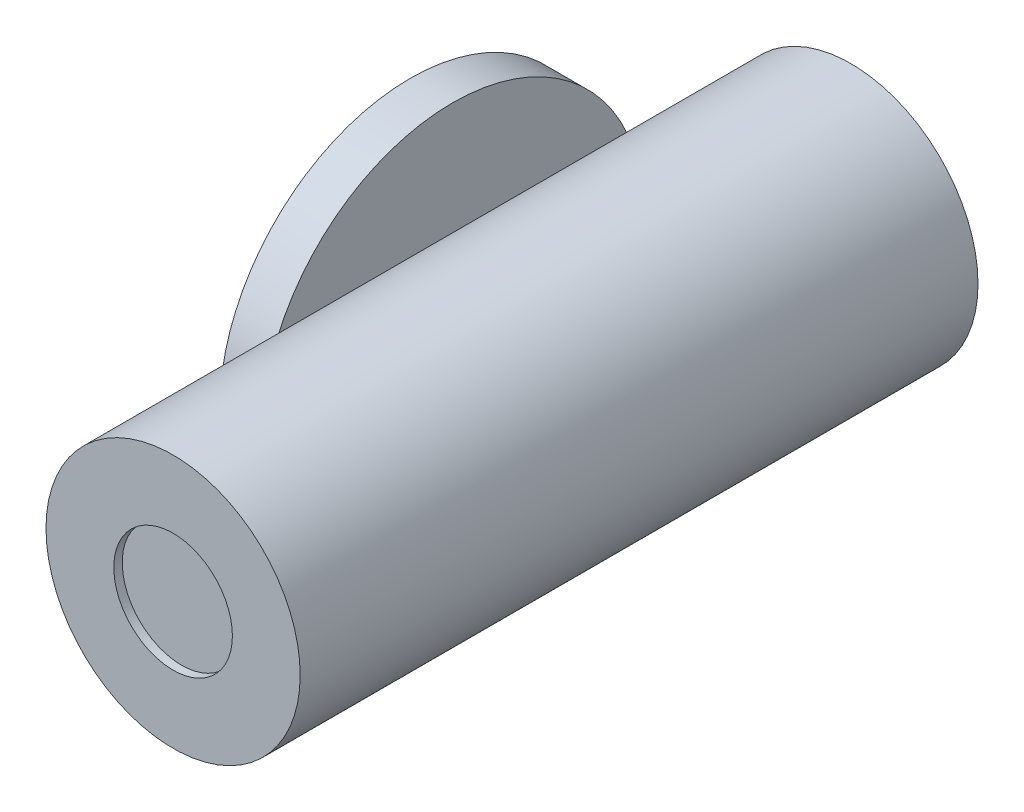
ISO-10303-21;
HEADER;
FILE_DESCRIPTION(('STEP AP214'),'2;1');
FILE_NAME('part.step','',(''),(''),'','','');
FILE_SCHEMA(('AUTOMOTIVE_DESIGN { 1 0 10303 214 1 1 1 1 }'));
ENDSEC;
DATA;
#1=APPLICATION_CONTEXT('core data for automotive mechanical design processes');
#2=APPLICATION_PROTOCOL_DEFINITION('international standard','automotive_design',2000,#1);
#3=PRODUCT_CONTEXT('',#1,'mechanical');
#4=PRODUCT('Part','Part','',(#3));
#5=PRODUCT_RELATED_PRODUCT_CATEGORY('part','',(#4));
#6=PRODUCT_DEFINITION_FORMATION('','',#4);
#7=PRODUCT_DEFINITION_CONTEXT('part definition',#1,'design');
#8=PRODUCT_DEFINITION('design','',#6,#7);
#9=PRODUCT_DEFINITION_SHAPE('','',#8);
#10=(LENGTH_UNIT() NAMED_UNIT(*) SI_UNIT(.MILLI.,.METRE.));
#11=(NAMED_UNIT(*) PLANE_ANGLE_UNIT() SI_UNIT($,.RADIAN.));
#12=(NAMED_UNIT(*) SI_UNIT($,.STERADIAN.) SOLID_ANGLE_UNIT());
#13=UNCERTAINTY_MEASURE_WITH_UNIT(LENGTH_MEASURE(1.E-05),#10,'distance_accuracy_value','');
#14=(GEOMETRIC_REPRESENTATION_CONTEXT(3) GLOBAL_UNCERTAINTY_ASSIGNED_CONTEXT((#13)) GLOBAL_UNIT_ASSIGNED_CONTEXT((#10,
#11,#12)) REPRESENTATION_CONTEXT('',''));
#15=CARTESIAN_POINT('',(0.,0.,0.));
#16=DIRECTION('',(0.,0.,1.));
#17=DIRECTION('',(1.,0.,0.));
#18=AXIS2_PLACEMENT_3D('',#15,#16,#17);
#19=CARTESIAN_POINT('',(0.,0.,-800.));
#20=DIRECTION('',(0.,0.,1.));
#21=DIRECTION('',(1.,0.,0.));
#22=AXIS2_PLACEMENT_3D('',#19,#20,#21);
#23=CYLINDRICAL_SURFACE('',#22,150.);
#24=DIRECTION('',(0.,0.,1.));
#25=VECTOR('',#24,1.);
#26=CARTESIAN_POINT('',(-120.,90.,-800.));
#27=LINE('',#26,#25);
#28=CARTESIAN_POINT('',(-120.,90.,-243.784093726987));
#29=VERTEX_POINT('',#28);
#30=CARTESIAN_POINT('',(-120.,90.,-656.215906273013));
#31=VERTEX_POINT('',#30);
#32=EDGE_CURVE('E43',#29,#31,#27,.F.);
#33=ORIENTED_EDGE('',*,*,#32,.F.);
#34=CARTESIAN_POINT('',(-120.,-90.,-243.784093726987));
#35=CARTESIAN_POINT('',(-121.126389329248,-88.4981454170554,-243.128612547082));
#36=CARTESIAN_POINT('',(-122.226549297826,-86.972528100177,-242.482328256559));
#37=CARTESIAN_POINT('',(-124.372689997783,-83.8748165642376,-241.211072203129));
#38=CARTESIAN_POINT('',(-125.418666353184,-82.3027186073626,-240.586102162991));
#39=CARTESIAN_POINT('',(-127.455283463712,-79.1121676508049,-239.360050697722));
#40=CARTESIAN_POINT('',(-128.445883082134,-77.4936815069204,-238.75898712472));
#41=CARTESIAN_POINT('',(-130.368951037826,-74.2128827527093,-237.584172542745));
#42=CARTESIAN_POINT('',(-131.301420604153,-72.5505710700543,-237.01042095637));
#43=CARTESIAN_POINT('',(-133.11098739874,-69.174792202597,-235.890150933076));
#44=CARTESIAN_POINT('',(-133.987766725815,-67.4611014967038,-235.343792047389));
#45=CARTESIAN_POINT('',(-135.678421905841,-63.9928703294791,-234.284446226629));
#46=CARTESIAN_POINT('',(-136.492298701666,-62.2383304809665,-233.771458791355));
#47=CARTESIAN_POINT('',(-138.054849986402,-58.6908353462642,-232.781731493138));
#48=CARTESIAN_POINT('',(-138.803537329067,-56.8978877204107,-232.304984486841));
#49=CARTESIAN_POINT('',(-140.233726013293,-53.2756375313788,-231.390311970333));
#50=CARTESIAN_POINT('',(-140.915227443234,-51.4463350160268,-230.952386409054));
#51=CARTESIAN_POINT('',(-142.21216020813,-47.7448060050651,-230.115822042446));
#52=CARTESIAN_POINT('',(-142.827243164258,-45.8724102876585,-229.717391212647));
#53=CARTESIAN_POINT('',(-143.985313451559,-42.0966602286225,-228.964761162196));
#54=CARTESIAN_POINT('',(-144.528300672953,-40.1933058398575,-228.610562008894));
#55=CARTESIAN_POINT('',(-145.540256761149,-36.358846240455,-227.948609906984));
#56=CARTESIAN_POINT('',(-146.009219524083,-34.4277387556767,-227.64086078862));
#57=CARTESIAN_POINT('',(-146.871276096703,-30.5416023593706,-227.073854573456));
#58=CARTESIAN_POINT('',(-147.264370135752,-28.5865735201794,-226.814597330057));
#59=CARTESIAN_POINT('',(-147.972099681991,-24.6621534340785,-226.346983205006));
#60=CARTESIAN_POINT('',(-148.286955845886,-22.6928190810244,-226.138483205701));
#61=CARTESIAN_POINT('',(-148.838353824848,-18.7384535650031,-225.772854086873));
#62=CARTESIAN_POINT('',(-149.074895253574,-16.7534223246497,-225.615725220773));
#63=CARTESIAN_POINT('',(-149.468626798959,-12.7722519355488,-225.353947786108));
#64=CARTESIAN_POINT('',(-149.62582465613,-10.7761138895635,-225.249294098234));
#65=CARTESIAN_POINT('',(-149.86020993863,-6.7770933021634,-225.093186319033));
#66=CARTESIAN_POINT('',(-149.937399158507,-4.77421091303138,-225.041731034495));
#67=CARTESIAN_POINT('',(-150.007998977627,-0.952275971438666,-224.994668401487));
#68=CARTESIAN_POINT('',(-150.008517727892,0.866592257668275,-224.994322664974));
#69=CARTESIAN_POINT('',(-149.94343147332,4.5025948688147,-225.037709775548));
#70=CARTESIAN_POINT('',(-149.877827792812,6.31972928485015,-225.081441739828));
#71=CARTESIAN_POINT('',(-149.680742782046,9.9487308497767,-225.212724180992));
#72=CARTESIAN_POINT('',(-149.549264943015,11.7605982726921,-225.300272335688));
#73=CARTESIAN_POINT('',(-149.220909191484,15.3757804032027,-225.518676247004));
#74=CARTESIAN_POINT('',(-149.024030931368,17.1790950652865,-225.649532233814));
#75=CARTESIAN_POINT('',(-148.565372400745,20.7754438863894,-225.953932347421));
#76=CARTESIAN_POINT('',(-148.303535152524,22.568467598659,-226.127513949238));
#77=CARTESIAN_POINT('',(-147.715954711025,26.1394539431661,-226.516321033362));
#78=CARTESIAN_POINT('',(-147.39021151744,27.9174165753312,-226.73154651587));
#79=CARTESIAN_POINT('',(-146.675917003816,31.455237538646,-227.202440495581));
#80=CARTESIAN_POINT('',(-146.287366545213,33.2150961177511,-227.458108438092));
#81=CARTESIAN_POINT('',(-145.448706345809,36.7138948239461,-228.008499986117));
#82=CARTESIAN_POINT('',(-144.998596789112,38.4528350135798,-228.303223474827));
#83=CARTESIAN_POINT('',(-144.047604979745,41.8733404942227,-228.92402814817));
#84=CARTESIAN_POINT('',(-143.547889267661,43.5553625406515,-229.249382453279));
#85=CARTESIAN_POINT('',(-142.491967609481,46.8946251748363,-229.934556448336));
#86=CARTESIAN_POINT('',(-141.93575670071,48.5518635708417,-230.294379165914));
#87=CARTESIAN_POINT('',(-140.768368376429,51.839259863326,-231.046730196239));
#88=CARTESIAN_POINT('',(-140.157192609807,53.4694185704302,-231.439257527855));
#89=CARTESIAN_POINT('',(-138.881323727456,56.700933159619,-232.255237579415));
#90=CARTESIAN_POINT('',(-138.216626450736,58.3022867904117,-232.678692703578));
#91=CARTESIAN_POINT('',(-136.835775575949,61.4732371732078,-233.554291652651));
#92=CARTESIAN_POINT('',(-136.119658400105,63.0428554137955,-234.006415144884));
#93=CARTESIAN_POINT('',(-134.63701493657,66.1501159263205,-234.937699665806));
#94=CARTESIAN_POINT('',(-133.870483817612,67.6877551150041,-235.416863285176));
#95=CARTESIAN_POINT('',(-132.288861550916,70.7290172549207,-236.400001681507));
#96=CARTESIAN_POINT('',(-131.473787129678,72.232651679545,-236.903967901994));
#97=CARTESIAN_POINT('',(-129.796309201291,75.2052564825286,-237.934811809991));
#98=CARTESIAN_POINT('',(-128.933906165138,76.6742272056398,-238.461689269485));
#99=CARTESIAN_POINT('',(-127.42177499108,79.1526351930659,-239.379344253218));
#100=CARTESIAN_POINT('',(-126.78348197799,80.1710000718726,-239.764936764988));
#101=CARTESIAN_POINT('',(-125.484483752138,82.1893197924488,-240.545741791629));
#102=CARTESIAN_POINT('',(-124.823782478275,83.1892778225678,-240.940952612391));
#103=CARTESIAN_POINT('',(-123.481758273038,85.1685507402848,-241.739455747228));
#104=CARTESIAN_POINT('',(-122.800481786653,86.1479047272368,-242.142729253254));
#105=CARTESIAN_POINT('',(-121.416316702075,88.0880138886836,-242.957469994577));
#106=CARTESIAN_POINT('',(-120.713424691792,89.0487660874051,-243.368938519839));
#107=CARTESIAN_POINT('',(-120.,90.,-243.784093726987));
#108=B_SPLINE_CURVE_WITH_KNOTS('',3,(#34,#35,#36,#37,#38,#39,#40,#41,#42,#43,#44,#45,#46,#47,
#48,#49,#50,#51,#52,#53,#54,#55,#56,#57,#58,#59,#60,#61,#62,#63,#64,#65,#66,#67,#68,#69,#70,#71,
#72,#73,#74,#75,#76,#77,#78,#79,#80,#81,#82,#83,#84,#85,#86,#87,#88,#89,#90,#91,#92,#93,#94,#95,
#96,#97,#98,#99,#100,#101,#102,#103,#104,#105,#106,#107),.UNSPECIFIED.,.F.,.F.,(4,2,2,2,2,2,2,2,
2,2,2,2,2,2,2,2,2,2,2,2,2,2,2,2,2,2,2,2,2,2,2,2,2,2,2,2,4),(0.,5.96513218474672,
11.9307453767817,17.900732802392,23.870593960355,29.871933827162,35.8731837197962,
41.8732476214524,47.8733036302769,53.9034414749585,59.9335885016052,65.9642324994873,
71.9948582655703,78.0082775370575,84.021726473421,90.0345886429363,96.047315944406,
101.502214842882,106.957004490451,112.411505073456,117.866034648726,123.325365596429,
128.784696570384,134.243952672845,139.703192448647,145.055552296592,150.408382716087,
155.761052609835,161.114139045433,166.463470442662,171.813315225729,177.161327166835,
182.509285896245,186.295562333564,190.081176637978,193.858804624669,197.637032016252),.UNSPECIFIED.);
#109=CARTESIAN_POINT('',(-120.,-90.,-243.784093726987));
#110=VERTEX_POINT('',#109);
#111=EDGE_CURVE('E65',#110,#29,#108,.T.);
#112=ORIENTED_EDGE('',*,*,#111,.F.);
#113=DIRECTION('',(0.,0.,1.));
#114=VECTOR('',#113,1.);
#115=CARTESIAN_POINT('',(-120.,-90.,-800.));
#116=LINE('',#115,#114);
#117=CARTESIAN_POINT('',(-120.,-90.,-656.215906273013));
#118=VERTEX_POINT('',#117);
#119=EDGE_CURVE('E68',#118,#110,#116,.T.);
#120=ORIENTED_EDGE('',*,*,#119,.F.);
#121=CARTESIAN_POINT('',(-120.,90.,-656.215906273013));
#122=CARTESIAN_POINT('',(-121.126389329248,88.4981454170554,-656.871387452918));
#123=CARTESIAN_POINT('',(-122.226549297826,86.972528100177,-657.517671743441));
#124=CARTESIAN_POINT('',(-124.372689997783,83.8748165642376,-658.788927796871));
#125=CARTESIAN_POINT('',(-125.418666353184,82.3027186073627,-659.41389783701));
#126=CARTESIAN_POINT('',(-127.455283463712,79.1121676508049,-660.639949302278));
#127=CARTESIAN_POINT('',(-128.445883082134,77.4936815069204,-661.241012875281));
#128=CARTESIAN_POINT('',(-130.368951037826,74.2128827527093,-662.415827457255));
#129=CARTESIAN_POINT('',(-131.301420604153,72.5505710700543,-662.98957904363));
#130=CARTESIAN_POINT('',(-133.110987398741,69.174792202597,-664.109849066924));
#131=CARTESIAN_POINT('',(-133.987766725815,67.4611014967038,-664.656207952611));
#132=CARTESIAN_POINT('',(-135.678421905841,63.9928703294791,-665.715553773371));
#133=CARTESIAN_POINT('',(-136.492298701666,62.2383304809665,-666.228541208645));
#134=CARTESIAN_POINT('',(-138.054849986402,58.6908353462642,-667.218268506862));
#135=CARTESIAN_POINT('',(-138.803537329067,56.8978877204107,-667.695015513159));
#136=CARTESIAN_POINT('',(-140.233726013293,53.2756375313787,-668.609688029668));
#137=CARTESIAN_POINT('',(-140.915227443234,51.4463350160268,-669.047613590947));
#138=CARTESIAN_POINT('',(-142.21216020813,47.7448060050651,-669.884177957554));
#139=CARTESIAN_POINT('',(-142.827243164258,45.8724102876585,-670.282608787353));
#140=CARTESIAN_POINT('',(-143.985313451559,42.0966602286225,-671.035238837805));
#141=CARTESIAN_POINT('',(-144.528300672953,40.1933058398575,-671.389437991106));
#142=CARTESIAN_POINT('',(-145.540256761149,36.358846240455,-672.051390093016));
#143=CARTESIAN_POINT('',(-146.009219524083,34.4277387556767,-672.35913921138));
#144=CARTESIAN_POINT('',(-146.871276096703,30.5416023593705,-672.926145426544));
#145=CARTESIAN_POINT('',(-147.264370135752,28.5865735201794,-673.185402669943));
#146=CARTESIAN_POINT('',(-147.972099681991,24.6621534340785,-673.653016794994));
#147=CARTESIAN_POINT('',(-148.286955845886,22.6928190810244,-673.861516794299));
#148=CARTESIAN_POINT('',(-148.838353824848,18.7384535650031,-674.227145913128));
#149=CARTESIAN_POINT('',(-149.074895253574,16.7534223246496,-674.384274779227));
#150=CARTESIAN_POINT('',(-149.468626798959,12.7722519355488,-674.646052213892));
#151=CARTESIAN_POINT('',(-149.62582465613,10.7761138895635,-674.750705901766));
#152=CARTESIAN_POINT('',(-149.86020993863,6.77709330216336,-674.906813680967));
#153=CARTESIAN_POINT('',(-149.937399158507,4.77421091303134,-674.958268965505));
#154=CARTESIAN_POINT('',(-150.007998977627,0.952275971438615,-675.005331598513));
#155=CARTESIAN_POINT('',(-150.008517727892,-0.866592257668336,-675.005677335026));
#156=CARTESIAN_POINT('',(-149.94343147332,-4.50259486881477,-674.962290224452));
#157=CARTESIAN_POINT('',(-149.877827792812,-6.31972928485022,-674.918558260173));
#158=CARTESIAN_POINT('',(-149.680742782046,-9.94873084977677,-674.787275819008));
#159=CARTESIAN_POINT('',(-149.549264943015,-11.7605982726921,-674.699727664312));
#160=CARTESIAN_POINT('',(-149.220909191484,-15.3757804032027,-674.481323752996));
#161=CARTESIAN_POINT('',(-149.024030931368,-17.1790950652866,-674.350467766186));
#162=CARTESIAN_POINT('',(-148.565372400745,-20.7754438863894,-674.046067652579));
#163=CARTESIAN_POINT('',(-148.303535152524,-22.568467598659,-673.872486050762));
#164=CARTESIAN_POINT('',(-147.715954711025,-26.1394539431662,-673.483678966638));
#165=CARTESIAN_POINT('',(-147.39021151744,-27.9174165753313,-673.26845348413));
#166=CARTESIAN_POINT('',(-146.675917003816,-31.4552375386461,-672.797559504419));
#167=CARTESIAN_POINT('',(-146.287366545213,-33.2150961177512,-672.541891561908));
#168=CARTESIAN_POINT('',(-145.448706345809,-36.7138948239461,-671.991500013883));
#169=CARTESIAN_POINT('',(-144.998596789112,-38.4528350135798,-671.696776525173));
#170=CARTESIAN_POINT('',(-144.047604979745,-41.8733404942228,-671.075971851831));
#171=CARTESIAN_POINT('',(-143.547889267661,-43.5553625406515,-670.750617546721));
#172=CARTESIAN_POINT('',(-142.491967609481,-46.8946251748363,-670.065443551664));
#173=CARTESIAN_POINT('',(-141.93575670071,-48.5518635708417,-669.705620834086));
#174=CARTESIAN_POINT('',(-140.768368376429,-51.839259863326,-668.953269803761));
#175=CARTESIAN_POINT('',(-140.157192609807,-53.4694185704302,-668.560742472145));
#176=CARTESIAN_POINT('',(-138.881323727456,-56.7009331596191,-667.744762420586));
#177=CARTESIAN_POINT('',(-138.216626450736,-58.3022867904117,-667.321307296422));
#178=CARTESIAN_POINT('',(-136.835775575949,-61.4732371732078,-666.44570834735));
#179=CARTESIAN_POINT('',(-136.119658400105,-63.0428554137954,-665.993584855116));
#180=CARTESIAN_POINT('',(-134.63701493657,-66.1501159263204,-665.062300334194));
#181=CARTESIAN_POINT('',(-133.870483817612,-67.6877551150041,-664.583136714824));
#182=CARTESIAN_POINT('',(-132.288861550916,-70.7290172549207,-663.599998318493));
#183=CARTESIAN_POINT('',(-131.473787129678,-72.232651679545,-663.096032098006));
#184=CARTESIAN_POINT('',(-129.796309201291,-75.2052564825286,-662.06518819001));
#185=CARTESIAN_POINT('',(-128.933906165138,-76.6742272056398,-661.538310730515));
#186=CARTESIAN_POINT('',(-127.42177499108,-79.1526351930659,-660.620655746782));
#187=CARTESIAN_POINT('',(-126.78348197799,-80.1710000718727,-660.235063235012));
#188=CARTESIAN_POINT('',(-125.484483752138,-82.1893197924488,-659.454258208371));
#189=CARTESIAN_POINT('',(-124.823782478275,-83.1892778225678,-659.059047387609));
#190=CARTESIAN_POINT('',(-123.481758273038,-85.1685507402848,-658.260544252773));
#191=CARTESIAN_POINT('',(-122.800481786653,-86.1479047272368,-657.857270746746));
#192=CARTESIAN_POINT('',(-121.416316702075,-88.0880138886836,-657.042530005423));
#193=CARTESIAN_POINT('',(-120.713424691792,-89.0487660874051,-656.631061480162));
#194=CARTESIAN_POINT('',(-120.,-90.,-656.215906273013));
#195=B_SPLINE_CURVE_WITH_KNOTS('',3,(#121,#122,#123,#124,#125,#126,#127,#128,#129,#130,#131,
#132,#133,#134,#135,#136,#137,#138,#139,#140,#141,#142,#143,#144,#145,#146,#147,#148,#149,#150,
#151,#152,#153,#154,#155,#156,#157,#158,#159,#160,#161,#162,#163,#164,#165,#166,#167,#168,#169,
#170,#171,#172,#173,#174,#175,#176,#177,#178,#179,#180,#181,#182,#183,#184,#185,#186,#187,#188,
#189,#190,#191,#192,#193,#194),.UNSPECIFIED.,.F.,.F.,(4,2,2,2,2,2,2,2,2,2,2,2,2,2,2,2,2,2,2,2,2,
2,2,2,2,2,2,2,2,2,2,2,2,2,2,2,4),(0.,5.96513218474667,11.9307453767817,17.900732802392,
23.870593960355,29.871933827162,35.8731837197962,41.8732476214524,47.8733036302769,
53.9034414749585,59.9335885016052,65.9642324994873,71.9948582655704,78.0082775370576,
84.0217264734211,90.0345886429364,96.047315944406,101.502214842882,106.957004490451,
112.411505073456,117.866034648727,123.325365596429,128.784696570384,134.243952672845,
139.703192448647,145.055552296592,150.408382716087,155.761052609835,161.114139045433,
166.463470442662,171.813315225729,177.161327166835,182.509285896245,186.295562333564,
190.081176637978,193.858804624669,197.637032016252),.UNSPECIFIED.);
#196=EDGE_CURVE('E54',#31,#118,#195,.T.);
#197=ORIENTED_EDGE('',*,*,#196,.F.);
#198=EDGE_LOOP('',(#33,#112,#120,#197));
#199=FACE_BOUND('',#198,.T.);
#200=CARTESIAN_POINT('',(0.,0.,-800.));
#201=DIRECTION('',(0.,0.,1.));
#202=DIRECTION('',(1.,0.,0.));
#203=AXIS2_PLACEMENT_3D('',#200,#201,#202);
#204=CIRCLE('',#203,150.);
#205=CARTESIAN_POINT('',(150.,0.,-800.));
#206=VERTEX_POINT('',#205);
#207=EDGE_CURVE('E79',#206,#206,#204,.T.);
#208=ORIENTED_EDGE('',*,*,#207,.T.);
#209=EDGE_LOOP('',(#208));
#210=FACE_BOUND('',#209,.T.);
#211=CARTESIAN_POINT('',(0.,0.,0.));
#212=DIRECTION('',(0.,0.,1.));
#213=DIRECTION('',(1.,0.,0.));
#214=AXIS2_PLACEMENT_3D('',#211,#212,#213);
#215=CIRCLE('',#214,150.);
#216=CARTESIAN_POINT('',(150.,0.,0.));
#217=VERTEX_POINT('',#216);
#218=EDGE_CURVE('E93',#217,#217,#215,.T.);
#219=ORIENTED_EDGE('',*,*,#218,.F.);
#220=EDGE_LOOP('',(#219));
#221=FACE_BOUND('',#220,.T.);
#222=ADVANCED_FACE('F39',(#199,#210,#221),#23,.T.);
#223=CARTESIAN_POINT('',(0.,0.,-800.));
#224=DIRECTION('',(0.,0.,1.));
#225=DIRECTION('',(1.,0.,0.));
#226=AXIS2_PLACEMENT_3D('',#223,#224,#225);
#227=PLANE('',#226);
#228=ORIENTED_EDGE('',*,*,#207,.F.);
#229=EDGE_LOOP('',(#228));
#230=FACE_BOUND('',#229,.T.);
#231=ADVANCED_FACE('F109',(#230),#227,.F.);
#232=CARTESIAN_POINT('',(0.,0.,0.));
#233=DIRECTION('',(0.,0.,1.));
#234=DIRECTION('',(1.,0.,0.));
#235=AXIS2_PLACEMENT_3D('',#232,#233,#234);
#236=PLANE('',#235);
#237=CARTESIAN_POINT('',(0.,0.,0.));
#238=DIRECTION('',(0.,0.,1.));
#239=DIRECTION('',(1.,0.,0.));
#240=AXIS2_PLACEMENT_3D('',#237,#238,#239);
#241=CIRCLE('',#240,70.);
#242=CARTESIAN_POINT('',(70.,0.,0.));
#243=VERTEX_POINT('',#242);
#244=EDGE_CURVE('E85',#243,#243,#241,.T.);
#245=ORIENTED_EDGE('',*,*,#244,.F.);
#246=EDGE_LOOP('',(#245));
#247=FACE_BOUND('',#246,.T.);
#248=ORIENTED_EDGE('',*,*,#218,.T.);
#249=EDGE_LOOP('',(#248));
#250=FACE_BOUND('',#249,.T.);
#251=ADVANCED_FACE('F114',(#247,#250),#236,.T.);
#252=CARTESIAN_POINT('',(-120.,0.,-450.));
#253=DIRECTION('',(1.,0.,0.));
#254=DIRECTION('',(0.,0.,-1.));
#255=AXIS2_PLACEMENT_3D('',#252,#253,#254);
#256=PLANE('',#255);
#257=CARTESIAN_POINT('',(-120.,0.,-450.));
#258=DIRECTION('',(1.,0.,0.));
#259=DIRECTION('',(0.,0.,-1.));
#260=AXIS2_PLACEMENT_3D('',#257,#258,#259);
#261=CIRCLE('',#260,225.);
#262=EDGE_CURVE('E78',#31,#29,#261,.T.);
#263=ORIENTED_EDGE('',*,*,#262,.T.);
#264=ORIENTED_EDGE('',*,*,#32,.T.);
#265=EDGE_LOOP('',(#263,#264));
#266=FACE_BOUND('',#265,.T.);
#267=ADVANCED_FACE('F110',(#266),#256,.T.);
#268=CARTESIAN_POINT('',(-170.,0.,-450.));
#269=DIRECTION('',(1.,0.,0.));
#270=DIRECTION('',(0.,0.,-1.));
#271=AXIS2_PLACEMENT_3D('',#268,#269,#270);
#272=CYLINDRICAL_SURFACE('',#271,225.);
#273=CARTESIAN_POINT('',(-170.,0.,-450.));
#274=DIRECTION('',(1.,0.,0.));
#275=DIRECTION('',(0.,0.,-1.));
#276=AXIS2_PLACEMENT_3D('',#273,#274,#275);
#277=CIRCLE('',#276,225.);
#278=CARTESIAN_POINT('',(-170.,0.,-675.));
#279=VERTEX_POINT('',#278);
#280=EDGE_CURVE('E84',#279,#279,#277,.T.);
#281=ORIENTED_EDGE('',*,*,#280,.T.);
#282=EDGE_LOOP('',(#281));
#283=FACE_BOUND('',#282,.T.);
#284=ORIENTED_EDGE('',*,*,#262,.F.);
#285=ORIENTED_EDGE('',*,*,#196,.T.);
#286=EDGE_CURVE('E73',#110,#118,#261,.T.);
#287=ORIENTED_EDGE('',*,*,#286,.F.);
#288=ORIENTED_EDGE('',*,*,#111,.T.);
#289=EDGE_LOOP('',(#284,#285,#287,#288));
#290=FACE_BOUND('',#289,.T.);
#291=ADVANCED_FACE('F80',(#283,#290),#272,.T.);
#292=CARTESIAN_POINT('',(-170.,0.,-450.));
#293=DIRECTION('',(1.,0.,0.));
#294=DIRECTION('',(0.,0.,-1.));
#295=AXIS2_PLACEMENT_3D('',#292,#293,#294);
#296=PLANE('',#295);
#297=CARTESIAN_POINT('',(-170.,0.,-450.));
#298=DIRECTION('',(-1.,0.,0.));
#299=DIRECTION('',(0.,0.,1.));
#300=AXIS2_PLACEMENT_3D('',#297,#298,#299);
#301=CIRCLE('',#300,70.);
#302=CARTESIAN_POINT('',(-170.,0.,-380.));
#303=VERTEX_POINT('',#302);
#304=EDGE_CURVE('E11',#303,#303,#301,.T.);
#305=ORIENTED_EDGE('',*,*,#304,.F.);
#306=EDGE_LOOP('',(#305));
#307=FACE_BOUND('',#306,.T.);
#308=ORIENTED_EDGE('',*,*,#280,.F.);
#309=EDGE_LOOP('',(#308));
#310=FACE_BOUND('',#309,.T.);
#311=ADVANCED_FACE('F106',(#307,#310),#296,.F.);
#312=ORIENTED_EDGE('',*,*,#286,.T.);
#313=ORIENTED_EDGE('',*,*,#119,.T.);
#314=EDGE_LOOP('',(#312,#313));
#315=FACE_BOUND('',#314,.T.);
#316=ADVANCED_FACE('F74',(#315),#256,.T.);
#317=CARTESIAN_POINT('',(0.,0.,-10.));
#318=DIRECTION('',(0.,0.,1.));
#319=DIRECTION('',(1.,0.,0.));
#320=AXIS2_PLACEMENT_3D('',#317,#318,#319);
#321=CYLINDRICAL_SURFACE('',#320,70.);
#322=CARTESIAN_POINT('',(0.,0.,-10.));
#323=DIRECTION('',(0.,0.,1.));
#324=DIRECTION('',(1.,0.,0.));
#325=AXIS2_PLACEMENT_3D('',#322,#323,#324);
#326=CIRCLE('',#325,70.);
#327=CARTESIAN_POINT('',(70.,0.,-10.));
#328=VERTEX_POINT('',#327);
#329=EDGE_CURVE('E77',#328,#328,#326,.T.);
#330=ORIENTED_EDGE('',*,*,#329,.F.);
#331=EDGE_LOOP('',(#330));
#332=FACE_BOUND('',#331,.T.);
#333=ORIENTED_EDGE('',*,*,#244,.T.);
#334=EDGE_LOOP('',(#333));
#335=FACE_BOUND('',#334,.T.);
#336=ADVANCED_FACE('F148',(#332,#335),#321,.F.);
#337=CARTESIAN_POINT('',(0.,0.,-10.));
#338=DIRECTION('',(0.,0.,1.));
#339=DIRECTION('',(1.,0.,0.));
#340=AXIS2_PLACEMENT_3D('',#337,#338,#339);
#341=PLANE('',#340);
#342=ORIENTED_EDGE('',*,*,#329,.T.);
#343=EDGE_LOOP('',(#342));
#344=FACE_BOUND('',#343,.T.);
#345=ADVANCED_FACE('F159',(#344),#341,.T.);
#346=CARTESIAN_POINT('',(-180.,0.,-450.));
#347=DIRECTION('',(1.,0.,0.));
#348=DIRECTION('',(0.,0.,-1.));
#349=AXIS2_PLACEMENT_3D('',#346,#347,#348);
#350=CYLINDRICAL_SURFACE('',#349,70.);
#351=CARTESIAN_POINT('',(-180.,0.,-450.));
#352=DIRECTION('',(-1.,0.,0.));
#353=DIRECTION('',(0.,0.,1.));
#354=AXIS2_PLACEMENT_3D('',#351,#352,#353);
#355=CIRCLE('',#354,70.);
#356=CARTESIAN_POINT('',(-180.,0.,-380.));
#357=VERTEX_POINT('',#356);
#358=EDGE_CURVE('E205',#357,#357,#355,.T.);
#359=ORIENTED_EDGE('',*,*,#358,.F.);
#360=EDGE_LOOP('',(#359));
#361=FACE_BOUND('',#360,.T.);
#362=ORIENTED_EDGE('',*,*,#304,.T.);
#363=EDGE_LOOP('',(#362));
#364=FACE_BOUND('',#363,.T.);
#365=ADVANCED_FACE('F168',(#361,#364),#350,.T.);
#366=CARTESIAN_POINT('',(-180.,0.,-450.));
#367=DIRECTION('',(-1.,0.,0.));
#368=DIRECTION('',(0.,0.,1.));
#369=AXIS2_PLACEMENT_3D('',#366,#367,#368);
#370=PLANE('',#369);
#371=ORIENTED_EDGE('',*,*,#358,.T.);
#372=EDGE_LOOP('',(#371));
#373=FACE_BOUND('',#372,.T.);
#374=ADVANCED_FACE('F176',(#373),#370,.T.);
#375=CLOSED_SHELL('',(#222,#231,#251,#267,#291,#311,#316,#336,#345,#365,#374));
#376=MANIFOLD_SOLID_BREP('B2',#375);
#377=ADVANCED_BREP_SHAPE_REPRESENTATION('',(#18,#376),#14);
#378=SHAPE_DEFINITION_REPRESENTATION(#9,#377);
ENDSEC;
END-ISO-10303-21;
